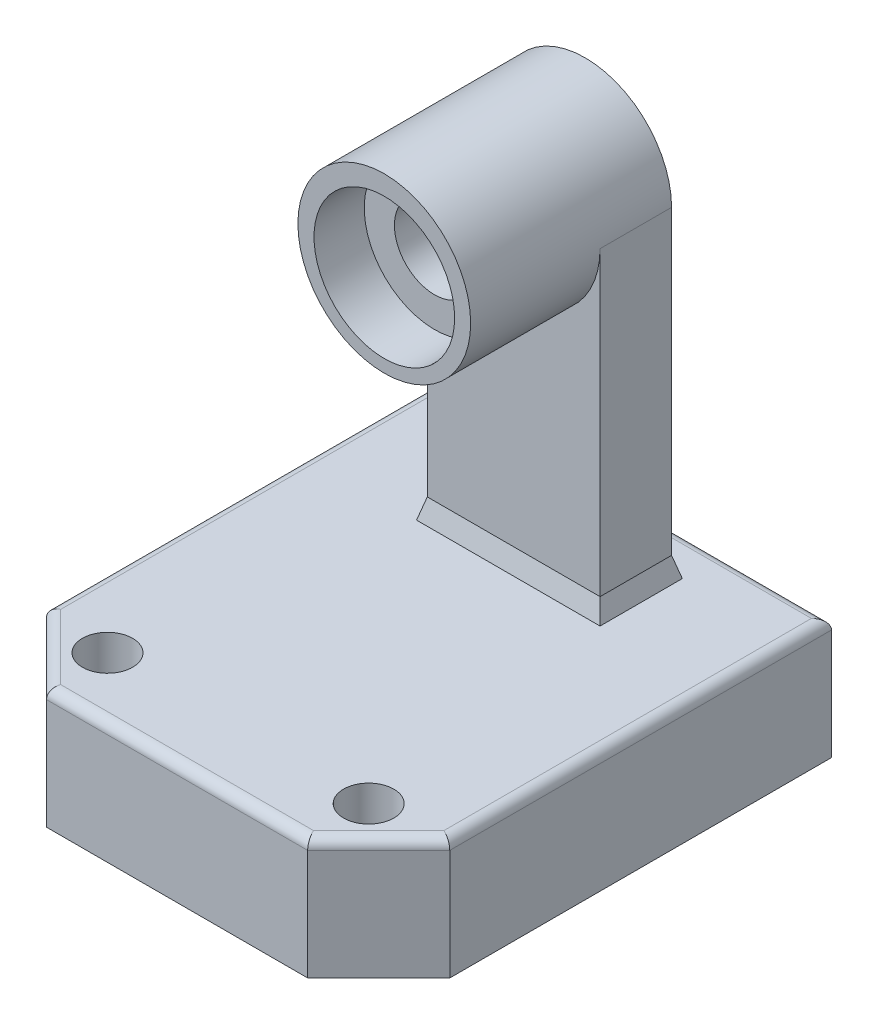
ISO-10303-21;
HEADER;
FILE_DESCRIPTION(('STEP AP214'),'2;1');
FILE_NAME('part.step','',(''),(''),'','','');
FILE_SCHEMA(('AUTOMOTIVE_DESIGN { 1 0 10303 214 1 1 1 1 }'));
ENDSEC;
DATA;
#1=APPLICATION_CONTEXT('core data for automotive mechanical design processes');
#2=APPLICATION_PROTOCOL_DEFINITION('international standard','automotive_design',2000,#1);
#3=PRODUCT_CONTEXT('',#1,'mechanical');
#4=PRODUCT('Part','Part','',(#3));
#5=PRODUCT_RELATED_PRODUCT_CATEGORY('part','',(#4));
#6=PRODUCT_DEFINITION_FORMATION('','',#4);
#7=PRODUCT_DEFINITION_CONTEXT('part definition',#1,'design');
#8=PRODUCT_DEFINITION('design','',#6,#7);
#9=PRODUCT_DEFINITION_SHAPE('','',#8);
#10=(LENGTH_UNIT() NAMED_UNIT(*) SI_UNIT(.MILLI.,.METRE.));
#11=(NAMED_UNIT(*) PLANE_ANGLE_UNIT() SI_UNIT($,.RADIAN.));
#12=(NAMED_UNIT(*) SI_UNIT($,.STERADIAN.) SOLID_ANGLE_UNIT());
#13=UNCERTAINTY_MEASURE_WITH_UNIT(LENGTH_MEASURE(1.E-05),#10,'distance_accuracy_value','');
#14=(GEOMETRIC_REPRESENTATION_CONTEXT(3) GLOBAL_UNCERTAINTY_ASSIGNED_CONTEXT((#13)) GLOBAL_UNIT_ASSIGNED_CONTEXT((#10,
#11,#12)) REPRESENTATION_CONTEXT('',''));
#15=CARTESIAN_POINT('',(0.,0.,0.));
#16=DIRECTION('',(0.,0.,1.));
#17=DIRECTION('',(1.,0.,0.));
#18=AXIS2_PLACEMENT_3D('',#15,#16,#17);
#19=CARTESIAN_POINT('',(0.,12.,0.));
#20=DIRECTION('',(0.,1.,0.));
#21=DIRECTION('',(0.,0.,1.));
#22=AXIS2_PLACEMENT_3D('',#19,#20,#21);
#23=PLANE('',#22);
#24=CARTESIAN_POINT('',(33.0710678118656,12.,39.));
#25=DIRECTION('',(0.,1.,0.));
#26=DIRECTION('',(0.,0.,1.));
#27=AXIS2_PLACEMENT_3D('',#24,#25,#26);
#28=CIRCLE('',#27,2.5);
#29=CARTESIAN_POINT('',(33.0710678118656,12.,41.5));
#30=VERTEX_POINT('',#29);
#31=EDGE_CURVE('E183',#30,#30,#28,.T.);
#32=ORIENTED_EDGE('',*,*,#31,.F.);
#33=EDGE_LOOP('',(#32));
#34=FACE_BOUND('',#33,.T.);
#35=CARTESIAN_POINT('',(7.07106781186556,12.,39.));
#36=DIRECTION('',(0.,1.,0.));
#37=DIRECTION('',(0.,0.,1.));
#38=AXIS2_PLACEMENT_3D('',#35,#36,#37);
#39=CIRCLE('',#38,2.5);
#40=CARTESIAN_POINT('',(7.07106781186556,12.,41.5));
#41=VERTEX_POINT('',#40);
#42=EDGE_CURVE('E180',#41,#41,#39,.T.);
#43=ORIENTED_EDGE('',*,*,#42,.F.);
#44=EDGE_LOOP('',(#43));
#45=FACE_BOUND('',#44,.T.);
#46=DIRECTION('',(0.,0.,1.));
#47=VECTOR('',#46,1.);
#48=CARTESIAN_POINT('',(39.1421356237311,12.,0.));
#49=LINE('',#48,#47);
#50=CARTESIAN_POINT('',(39.1421356237311,12.,37.5857864376269));
#51=VERTEX_POINT('',#50);
#52=CARTESIAN_POINT('',(39.1421356237311,12.,1.));
#53=VERTEX_POINT('',#52);
#54=EDGE_CURVE('E266',#51,#53,#49,.F.);
#55=ORIENTED_EDGE('',*,*,#54,.T.);
#56=DIRECTION('',(1.,0.,0.));
#57=VECTOR('',#56,1.);
#58=CARTESIAN_POINT('',(0.,12.,1.));
#59=LINE('',#58,#57);
#60=CARTESIAN_POINT('',(1.,12.,1.));
#61=VERTEX_POINT('',#60);
#62=EDGE_CURVE('E268',#53,#61,#59,.F.);
#63=ORIENTED_EDGE('',*,*,#62,.T.);
#64=DIRECTION('',(0.,0.,1.));
#65=VECTOR('',#64,1.);
#66=CARTESIAN_POINT('',(1.,12.,38.));
#67=LINE('',#66,#65);
#68=CARTESIAN_POINT('',(1.,12.,37.5857864376269));
#69=VERTEX_POINT('',#68);
#70=EDGE_CURVE('E258',#61,#69,#67,.T.);
#71=ORIENTED_EDGE('',*,*,#70,.T.);
#72=DIRECTION('',(0.707106781186557,0.,0.707106781186539));
#73=VECTOR('',#72,1.);
#74=CARTESIAN_POINT('',(7.77817459305211,12.,44.3639610306788));
#75=LINE('',#74,#73);
#76=CARTESIAN_POINT('',(7.48528137423865,12.,44.0710678118654));
#77=VERTEX_POINT('',#76);
#78=EDGE_CURVE('E260',#69,#77,#75,.T.);
#79=ORIENTED_EDGE('',*,*,#78,.T.);
#80=DIRECTION('',(1.,0.,0.));
#81=VECTOR('',#80,1.);
#82=CARTESIAN_POINT('',(33.0710678118656,12.,44.0710678118654));
#83=LINE('',#82,#81);
#84=CARTESIAN_POINT('',(32.6568542494925,12.,44.0710678118654));
#85=VERTEX_POINT('',#84);
#86=EDGE_CURVE('E262',#77,#85,#83,.T.);
#87=ORIENTED_EDGE('',*,*,#86,.T.);
#88=DIRECTION('',(0.707106781186556,0.,-0.707106781186539));
#89=VECTOR('',#88,1.);
#90=CARTESIAN_POINT('',(39.4350288425446,12.,37.2928932188134));
#91=LINE('',#90,#89);
#92=EDGE_CURVE('E264',#85,#51,#91,.T.);
#93=ORIENTED_EDGE('',*,*,#92,.T.);
#94=EDGE_LOOP('',(#55,#63,#71,#79,#87,#93));
#95=FACE_BOUND('',#94,.T.);
#96=DIRECTION('',(0.,0.,1.));
#97=VECTOR('',#96,1.);
#98=CARTESIAN_POINT('',(29.2843659279355,12.,3.99081846717642));
#99=LINE('',#98,#97);
#100=CARTESIAN_POINT('',(29.2843659279355,12.,3.99081846717642));
#101=VERTEX_POINT('',#100);
#102=CARTESIAN_POINT('',(29.2843659279355,12.,12.180416792572));
#103=VERTEX_POINT('',#102);
#104=EDGE_CURVE('E200',#101,#103,#99,.T.);
#105=ORIENTED_EDGE('',*,*,#104,.T.);
#106=DIRECTION('',(1.,0.,0.));
#107=VECTOR('',#106,1.);
#108=CARTESIAN_POINT('',(11.015261971284,12.,12.180416792572));
#109=LINE('',#108,#107);
#110=CARTESIAN_POINT('',(11.015261971284,12.,12.180416792572));
#111=VERTEX_POINT('',#110);
#112=EDGE_CURVE('E197',#111,#103,#109,.T.);
#113=ORIENTED_EDGE('',*,*,#112,.F.);
#114=DIRECTION('',(0.,0.,1.));
#115=VECTOR('',#114,1.);
#116=CARTESIAN_POINT('',(11.015261971284,12.,3.99081846717642));
#117=LINE('',#116,#115);
#118=CARTESIAN_POINT('',(11.015261971284,12.,3.99081846717642));
#119=VERTEX_POINT('',#118);
#120=EDGE_CURVE('E204',#119,#111,#117,.T.);
#121=ORIENTED_EDGE('',*,*,#120,.F.);
#122=DIRECTION('',(1.,0.,0.));
#123=VECTOR('',#122,1.);
#124=CARTESIAN_POINT('',(11.015261971284,12.,3.99081846717642));
#125=LINE('',#124,#123);
#126=EDGE_CURVE('E50',#119,#101,#125,.T.);
#127=ORIENTED_EDGE('',*,*,#126,.T.);
#128=EDGE_LOOP('',(#105,#113,#121,#127));
#129=FACE_BOUND('',#128,.T.);
#130=ADVANCED_FACE('F33',(#34,#45,#95,#129),#23,.T.);
#131=CARTESIAN_POINT('',(0.,12.,0.));
#132=DIRECTION('',(1.,0.,0.));
#133=DIRECTION('',(0.,0.,-1.));
#134=AXIS2_PLACEMENT_3D('',#131,#132,#133);
#135=PLANE('',#134);
#136=DIRECTION('',(0.,-1.,0.));
#137=VECTOR('',#136,1.);
#138=CARTESIAN_POINT('',(0.,12.,38.));
#139=LINE('',#138,#137);
#140=CARTESIAN_POINT('',(0.,11.,38.));
#141=VERTEX_POINT('',#140);
#142=CARTESIAN_POINT('',(0.,0.,38.));
#143=VERTEX_POINT('',#142);
#144=EDGE_CURVE('E253',#141,#143,#139,.T.);
#145=ORIENTED_EDGE('',*,*,#144,.F.);
#146=DIRECTION('',(0.,0.,1.));
#147=VECTOR('',#146,1.);
#148=CARTESIAN_POINT('',(0.,11.,0.));
#149=LINE('',#148,#147);
#150=CARTESIAN_POINT('',(0.,11.,0.));
#151=VERTEX_POINT('',#150);
#152=EDGE_CURVE('E11',#141,#151,#149,.F.);
#153=ORIENTED_EDGE('',*,*,#152,.T.);
#154=DIRECTION('',(0.,-1.,0.));
#155=VECTOR('',#154,1.);
#156=CARTESIAN_POINT('',(0.,12.,0.));
#157=LINE('',#156,#155);
#158=CARTESIAN_POINT('',(0.,0.,0.));
#159=VERTEX_POINT('',#158);
#160=EDGE_CURVE('E243',#151,#159,#157,.T.);
#161=ORIENTED_EDGE('',*,*,#160,.T.);
#162=DIRECTION('',(0.,0.,1.));
#163=VECTOR('',#162,1.);
#164=CARTESIAN_POINT('',(0.,0.,0.));
#165=LINE('',#164,#163);
#166=EDGE_CURVE('E225',#159,#143,#165,.T.);
#167=ORIENTED_EDGE('',*,*,#166,.T.);
#168=EDGE_LOOP('',(#145,#153,#161,#167));
#169=FACE_BOUND('',#168,.T.);
#170=ADVANCED_FACE('F313',(#169),#135,.F.);
#171=CARTESIAN_POINT('',(0.,12.,38.));
#172=DIRECTION('',(0.707106781186539,0.,-0.707106781186557));
#173=DIRECTION('',(-0.707106781186557,0.,-0.707106781186539));
#174=AXIS2_PLACEMENT_3D('',#171,#172,#173);
#175=PLANE('',#174);
#176=DIRECTION('',(0.,-1.,0.));
#177=VECTOR('',#176,1.);
#178=CARTESIAN_POINT('',(7.07106781186557,12.,45.0710678118654));
#179=LINE('',#178,#177);
#180=CARTESIAN_POINT('',(7.07106781186557,11.,45.0710678118654));
#181=VERTEX_POINT('',#180);
#182=CARTESIAN_POINT('',(7.07106781186557,0.,45.0710678118654));
#183=VERTEX_POINT('',#182);
#184=EDGE_CURVE('E251',#181,#183,#179,.T.);
#185=ORIENTED_EDGE('',*,*,#184,.F.);
#186=DIRECTION('',(0.707106781186557,0.,0.707106781186539));
#187=VECTOR('',#186,1.);
#188=CARTESIAN_POINT('',(0.,11.,38.));
#189=LINE('',#188,#187);
#190=EDGE_CURVE('E42',#181,#141,#189,.F.);
#191=ORIENTED_EDGE('',*,*,#190,.T.);
#192=ORIENTED_EDGE('',*,*,#144,.T.);
#193=DIRECTION('',(0.707106781186556,0.,0.707106781186538));
#194=VECTOR('',#193,1.);
#195=CARTESIAN_POINT('',(0.,0.,38.));
#196=LINE('',#195,#194);
#197=EDGE_CURVE('E228',#143,#183,#196,.T.);
#198=ORIENTED_EDGE('',*,*,#197,.T.);
#199=EDGE_LOOP('',(#185,#191,#192,#198));
#200=FACE_BOUND('',#199,.T.);
#201=ADVANCED_FACE('F325',(#200),#175,.F.);
#202=CARTESIAN_POINT('',(7.07106781186557,12.,45.0710678118654));
#203=DIRECTION('',(0.,0.,-1.));
#204=DIRECTION('',(-1.,0.,0.));
#205=AXIS2_PLACEMENT_3D('',#202,#203,#204);
#206=PLANE('',#205);
#207=DIRECTION('',(0.,-1.,0.));
#208=VECTOR('',#207,1.);
#209=CARTESIAN_POINT('',(33.0710678118656,12.,45.0710678118654));
#210=LINE('',#209,#208);
#211=CARTESIAN_POINT('',(33.0710678118656,11.,45.0710678118654));
#212=VERTEX_POINT('',#211);
#213=CARTESIAN_POINT('',(33.0710678118656,0.,45.0710678118654));
#214=VERTEX_POINT('',#213);
#215=EDGE_CURVE('E249',#212,#214,#210,.T.);
#216=ORIENTED_EDGE('',*,*,#215,.F.);
#217=DIRECTION('',(1.,0.,0.));
#218=VECTOR('',#217,1.);
#219=CARTESIAN_POINT('',(7.07106781186557,11.,45.0710678118654));
#220=LINE('',#219,#218);
#221=EDGE_CURVE('E275',#212,#181,#220,.F.);
#222=ORIENTED_EDGE('',*,*,#221,.T.);
#223=ORIENTED_EDGE('',*,*,#184,.T.);
#224=DIRECTION('',(1.,0.,0.));
#225=VECTOR('',#224,1.);
#226=CARTESIAN_POINT('',(7.07106781186557,0.,45.0710678118654));
#227=LINE('',#226,#225);
#228=EDGE_CURVE('E231',#183,#214,#227,.T.);
#229=ORIENTED_EDGE('',*,*,#228,.T.);
#230=EDGE_LOOP('',(#216,#222,#223,#229));
#231=FACE_BOUND('',#230,.T.);
#232=ADVANCED_FACE('F328',(#231),#206,.F.);
#233=CARTESIAN_POINT('',(33.0710678118656,12.,45.0710678118654));
#234=DIRECTION('',(-0.707106781186539,0.,-0.707106781186556));
#235=DIRECTION('',(-0.707106781186556,0.,0.707106781186539));
#236=AXIS2_PLACEMENT_3D('',#233,#234,#235);
#237=PLANE('',#236);
#238=DIRECTION('',(0.,-1.,0.));
#239=VECTOR('',#238,1.);
#240=CARTESIAN_POINT('',(40.1421356237311,12.,38.));
#241=LINE('',#240,#239);
#242=CARTESIAN_POINT('',(40.1421356237311,11.,38.));
#243=VERTEX_POINT('',#242);
#244=CARTESIAN_POINT('',(40.1421356237311,0.,38.));
#245=VERTEX_POINT('',#244);
#246=EDGE_CURVE('E247',#243,#245,#241,.T.);
#247=ORIENTED_EDGE('',*,*,#246,.F.);
#248=DIRECTION('',(0.707106781186556,0.,-0.707106781186539));
#249=VECTOR('',#248,1.);
#250=CARTESIAN_POINT('',(33.0710678118656,11.,45.0710678118654));
#251=LINE('',#250,#249);
#252=EDGE_CURVE('E273',#243,#212,#251,.F.);
#253=ORIENTED_EDGE('',*,*,#252,.T.);
#254=ORIENTED_EDGE('',*,*,#215,.T.);
#255=DIRECTION('',(0.707106781186556,0.,-0.707106781186539));
#256=VECTOR('',#255,1.);
#257=CARTESIAN_POINT('',(33.0710678118656,0.,45.0710678118654));
#258=LINE('',#257,#256);
#259=EDGE_CURVE('E234',#214,#245,#258,.T.);
#260=ORIENTED_EDGE('',*,*,#259,.T.);
#261=EDGE_LOOP('',(#247,#253,#254,#260));
#262=FACE_BOUND('',#261,.T.);
#263=ADVANCED_FACE('F331',(#262),#237,.F.);
#264=CARTESIAN_POINT('',(40.1421356237311,12.,0.));
#265=DIRECTION('',(1.,0.,0.));
#266=DIRECTION('',(0.,0.,-1.));
#267=AXIS2_PLACEMENT_3D('',#264,#265,#266);
#268=PLANE('',#267);
#269=DIRECTION('',(0.,-1.,0.));
#270=VECTOR('',#269,1.);
#271=CARTESIAN_POINT('',(40.1421356237311,12.,0.));
#272=LINE('',#271,#270);
#273=CARTESIAN_POINT('',(40.1421356237311,11.,0.));
#274=VERTEX_POINT('',#273);
#275=CARTESIAN_POINT('',(40.1421356237311,0.,0.));
#276=VERTEX_POINT('',#275);
#277=EDGE_CURVE('E245',#274,#276,#272,.T.);
#278=ORIENTED_EDGE('',*,*,#277,.F.);
#279=DIRECTION('',(0.,0.,1.));
#280=VECTOR('',#279,1.);
#281=CARTESIAN_POINT('',(40.1421356237311,11.,0.));
#282=LINE('',#281,#280);
#283=EDGE_CURVE('E271',#274,#243,#282,.T.);
#284=ORIENTED_EDGE('',*,*,#283,.T.);
#285=ORIENTED_EDGE('',*,*,#246,.T.);
#286=DIRECTION('',(0.,0.,1.));
#287=VECTOR('',#286,1.);
#288=CARTESIAN_POINT('',(40.1421356237311,0.,0.));
#289=LINE('',#288,#287);
#290=EDGE_CURVE('E237',#276,#245,#289,.T.);
#291=ORIENTED_EDGE('',*,*,#290,.F.);
#292=EDGE_LOOP('',(#278,#284,#285,#291));
#293=FACE_BOUND('',#292,.T.);
#294=ADVANCED_FACE('F367',(#293),#268,.T.);
#295=CARTESIAN_POINT('',(0.,12.,0.));
#296=DIRECTION('',(0.,0.,-1.));
#297=DIRECTION('',(-1.,0.,0.));
#298=AXIS2_PLACEMENT_3D('',#295,#296,#297);
#299=PLANE('',#298);
#300=ORIENTED_EDGE('',*,*,#160,.F.);
#301=DIRECTION('',(1.,0.,0.));
#302=VECTOR('',#301,1.);
#303=CARTESIAN_POINT('',(0.,11.,0.));
#304=LINE('',#303,#302);
#305=EDGE_CURVE('E255',#151,#274,#304,.T.);
#306=ORIENTED_EDGE('',*,*,#305,.T.);
#307=ORIENTED_EDGE('',*,*,#277,.T.);
#308=DIRECTION('',(1.,0.,0.));
#309=VECTOR('',#308,1.);
#310=CARTESIAN_POINT('',(0.,0.,0.));
#311=LINE('',#310,#309);
#312=EDGE_CURVE('E240',#159,#276,#311,.T.);
#313=ORIENTED_EDGE('',*,*,#312,.F.);
#314=EDGE_LOOP('',(#300,#306,#307,#313));
#315=FACE_BOUND('',#314,.T.);
#316=ADVANCED_FACE('F317',(#315),#299,.T.);
#317=CARTESIAN_POINT('',(0.,0.,0.));
#318=DIRECTION('',(0.,1.,0.));
#319=DIRECTION('',(0.,0.,1.));
#320=AXIS2_PLACEMENT_3D('',#317,#318,#319);
#321=PLANE('',#320);
#322=ORIENTED_EDGE('',*,*,#166,.F.);
#323=ORIENTED_EDGE('',*,*,#312,.T.);
#324=ORIENTED_EDGE('',*,*,#290,.T.);
#325=ORIENTED_EDGE('',*,*,#259,.F.);
#326=ORIENTED_EDGE('',*,*,#228,.F.);
#327=ORIENTED_EDGE('',*,*,#197,.F.);
#328=EDGE_LOOP('',(#322,#323,#324,#325,#326,#327));
#329=FACE_BOUND('',#328,.T.);
#330=ADVANCED_FACE('F321',(#329),#321,.F.);
#331=CARTESIAN_POINT('',(0.,11.,44.0710678118654));
#332=DIRECTION('',(-1.,0.,0.));
#333=DIRECTION('',(0.,0.,1.));
#334=AXIS2_PLACEMENT_3D('',#331,#332,#333);
#335=CYLINDRICAL_SURFACE('',#334,1.);
#336=CARTESIAN_POINT('',(32.6568542494925,11.,44.0710678118654));
#337=DIRECTION('',(-0.923879532511289,0.,0.382683432365084));
#338=DIRECTION('',(-0.382683432365084,0.,-0.923879532511289));
#339=AXIS2_PLACEMENT_3D('',#336,#337,#338);
#340=ELLIPSE('',#339,1.08239220029239,1.);
#341=EDGE_CURVE('E286',#85,#212,#340,.F.);
#342=ORIENTED_EDGE('',*,*,#341,.F.);
#343=ORIENTED_EDGE('',*,*,#86,.F.);
#344=CARTESIAN_POINT('',(7.48528137423865,11.,44.0710678118654));
#345=DIRECTION('',(-0.923879532511289,0.,-0.382683432365084));
#346=DIRECTION('',(0.382683432365084,0.,-0.923879532511289));
#347=AXIS2_PLACEMENT_3D('',#344,#345,#346);
#348=ELLIPSE('',#347,1.08239220029239,1.);
#349=EDGE_CURVE('E37',#181,#77,#348,.T.);
#350=ORIENTED_EDGE('',*,*,#349,.F.);
#351=ORIENTED_EDGE('',*,*,#221,.F.);
#352=EDGE_LOOP('',(#342,#343,#350,#351));
#353=FACE_BOUND('',#352,.T.);
#354=ADVANCED_FACE('F35',(#353),#335,.T.);
#355=CARTESIAN_POINT('',(-18.2928932188135,11.,18.2928932188139));
#356=DIRECTION('',(-0.707106781186557,0.,-0.707106781186539));
#357=DIRECTION('',(-0.707106781186539,0.,0.707106781186557));
#358=AXIS2_PLACEMENT_3D('',#355,#356,#357);
#359=CYLINDRICAL_SURFACE('',#358,1.);
#360=ORIENTED_EDGE('',*,*,#349,.T.);
#361=ORIENTED_EDGE('',*,*,#78,.F.);
#362=CARTESIAN_POINT('',(1.,11.,37.5857864376269));
#363=DIRECTION('',(-0.382683432365096,0.,-0.923879532511284));
#364=DIRECTION('',(0.923879532511284,0.,-0.382683432365096));
#365=AXIS2_PLACEMENT_3D('',#362,#363,#364);
#366=ELLIPSE('',#365,1.0823922002924,1.);
#367=EDGE_CURVE('E284',#141,#69,#366,.T.);
#368=ORIENTED_EDGE('',*,*,#367,.F.);
#369=ORIENTED_EDGE('',*,*,#190,.F.);
#370=EDGE_LOOP('',(#360,#361,#368,#369));
#371=FACE_BOUND('',#370,.T.);
#372=ADVANCED_FACE('F296',(#371),#359,.T.);
#373=CARTESIAN_POINT('',(38.3639610306785,11.,38.3639610306795));
#374=DIRECTION('',(-0.707106781186556,0.,0.707106781186539));
#375=DIRECTION('',(0.707106781186539,0.,0.707106781186556));
#376=AXIS2_PLACEMENT_3D('',#373,#374,#375);
#377=CYLINDRICAL_SURFACE('',#376,1.);
#378=ORIENTED_EDGE('',*,*,#341,.T.);
#379=ORIENTED_EDGE('',*,*,#252,.F.);
#380=CARTESIAN_POINT('',(39.1421356237311,11.,37.5857864376269));
#381=DIRECTION('',(-0.382683432365095,0.,0.923879532511285));
#382=DIRECTION('',(-0.923879532511285,0.,-0.382683432365095));
#383=AXIS2_PLACEMENT_3D('',#380,#381,#382);
#384=ELLIPSE('',#383,1.0823922002924,1.);
#385=EDGE_CURVE('E281',#51,#243,#384,.F.);
#386=ORIENTED_EDGE('',*,*,#385,.F.);
#387=ORIENTED_EDGE('',*,*,#92,.F.);
#388=EDGE_LOOP('',(#378,#379,#386,#387));
#389=FACE_BOUND('',#388,.T.);
#390=ADVANCED_FACE('F332',(#389),#377,.T.);
#391=CARTESIAN_POINT('',(1.,11.,0.));
#392=DIRECTION('',(0.,0.,-1.));
#393=DIRECTION('',(-1.,0.,0.));
#394=AXIS2_PLACEMENT_3D('',#391,#392,#393);
#395=CYLINDRICAL_SURFACE('',#394,1.);
#396=ORIENTED_EDGE('',*,*,#367,.T.);
#397=ORIENTED_EDGE('',*,*,#70,.F.);
#398=CARTESIAN_POINT('',(1.,11.,1.));
#399=DIRECTION('',(0.707106781186547,0.,-0.707106781186547));
#400=DIRECTION('',(-0.707106781186547,0.,-0.707106781186547));
#401=AXIS2_PLACEMENT_3D('',#398,#399,#400);
#402=ELLIPSE('',#401,1.41421356237309,1.);
#403=EDGE_CURVE('E279',#151,#61,#402,.T.);
#404=ORIENTED_EDGE('',*,*,#403,.F.);
#405=ORIENTED_EDGE('',*,*,#152,.F.);
#406=EDGE_LOOP('',(#396,#397,#404,#405));
#407=FACE_BOUND('',#406,.T.);
#408=ADVANCED_FACE('F308',(#407),#395,.T.);
#409=CARTESIAN_POINT('',(39.1421356237311,11.,0.));
#410=DIRECTION('',(0.,0.,1.));
#411=DIRECTION('',(1.,0.,0.));
#412=AXIS2_PLACEMENT_3D('',#409,#410,#411);
#413=CYLINDRICAL_SURFACE('',#412,1.);
#414=ORIENTED_EDGE('',*,*,#385,.T.);
#415=ORIENTED_EDGE('',*,*,#283,.F.);
#416=CARTESIAN_POINT('',(39.1421356237311,11.,1.));
#417=DIRECTION('',(0.707106781186548,0.,0.707106781186547));
#418=DIRECTION('',(-0.707106781186547,0.,0.707106781186548));
#419=AXIS2_PLACEMENT_3D('',#416,#417,#418);
#420=ELLIPSE('',#419,1.41421356237309,1.);
#421=EDGE_CURVE('E209',#53,#274,#420,.F.);
#422=ORIENTED_EDGE('',*,*,#421,.F.);
#423=ORIENTED_EDGE('',*,*,#54,.F.);
#424=EDGE_LOOP('',(#414,#415,#422,#423));
#425=FACE_BOUND('',#424,.T.);
#426=ADVANCED_FACE('F336',(#425),#413,.T.);
#427=CARTESIAN_POINT('',(0.,11.,1.));
#428=DIRECTION('',(1.,0.,0.));
#429=DIRECTION('',(0.,0.,-1.));
#430=AXIS2_PLACEMENT_3D('',#427,#428,#429);
#431=CYLINDRICAL_SURFACE('',#430,1.);
#432=ORIENTED_EDGE('',*,*,#403,.T.);
#433=ORIENTED_EDGE('',*,*,#62,.F.);
#434=ORIENTED_EDGE('',*,*,#421,.T.);
#435=ORIENTED_EDGE('',*,*,#305,.F.);
#436=EDGE_LOOP('',(#432,#433,#434,#435));
#437=FACE_BOUND('',#436,.T.);
#438=ADVANCED_FACE('F339',(#437),#431,.T.);
#439=CARTESIAN_POINT('',(11.015261971284,12.,12.180416792572));
#440=DIRECTION('',(0.,0.258819045102521,0.965925826289068));
#441=DIRECTION('',(0.,-0.965925826289068,0.258819045102521));
#442=AXIS2_PLACEMENT_3D('',#439,#440,#441);
#443=PLANE('',#442);
#444=ORIENTED_EDGE('',*,*,#112,.T.);
#445=DIRECTION('',(-0.250562807085732,0.935113126531029,-0.250562807085732));
#446=VECTOR('',#445,1.);
#447=CARTESIAN_POINT('',(28.1374001532946,16.2805345455027,11.033451017931));
#448=LINE('',#447,#446);
#449=CARTESIAN_POINT('',(28.7484675430733,14.,11.6445184077097));
#450=VERTEX_POINT('',#449);
#451=EDGE_CURVE('E207',#450,#103,#448,.F.);
#452=ORIENTED_EDGE('',*,*,#451,.F.);
#453=DIRECTION('',(-1.,0.,0.));
#454=VECTOR('',#453,1.);
#455=CARTESIAN_POINT('',(0.,14.,11.6445184077097));
#456=LINE('',#455,#454);
#457=CARTESIAN_POINT('',(11.5511603561462,14.,11.6445184077097));
#458=VERTEX_POINT('',#457);
#459=EDGE_CURVE('E206',#458,#450,#456,.F.);
#460=ORIENTED_EDGE('',*,*,#459,.F.);
#461=DIRECTION('',(-0.250562807085732,-0.935113126531029,0.250562807085732));
#462=VECTOR('',#461,1.);
#463=CARTESIAN_POINT('',(11.015261971284,12.,12.180416792572));
#464=LINE('',#463,#462);
#465=EDGE_CURVE('E211',#458,#111,#464,.T.);
#466=ORIENTED_EDGE('',*,*,#465,.T.);
#467=EDGE_LOOP('',(#444,#452,#460,#466));
#468=FACE_BOUND('',#467,.T.);
#469=ADVANCED_FACE('F341',(#468),#443,.T.);
#470=CARTESIAN_POINT('',(29.2843659279355,12.,3.99081846717642));
#471=DIRECTION('',(0.965925826289068,0.258819045102521,0.));
#472=DIRECTION('',(-0.258819045102521,0.965925826289068,0.));
#473=AXIS2_PLACEMENT_3D('',#470,#471,#472);
#474=PLANE('',#473);
#475=ORIENTED_EDGE('',*,*,#104,.F.);
#476=DIRECTION('',(0.250562807085732,-0.935113126531029,-0.250562807085732));
#477=VECTOR('',#476,1.);
#478=CARTESIAN_POINT('',(28.1374001532946,16.2805345455027,5.13778424181739));
#479=LINE('',#478,#477);
#480=CARTESIAN_POINT('',(28.7484675430733,14.,4.52671685203867));
#481=VERTEX_POINT('',#480);
#482=EDGE_CURVE('E210',#481,#101,#479,.T.);
#483=ORIENTED_EDGE('',*,*,#482,.F.);
#484=DIRECTION('',(0.,0.,1.));
#485=VECTOR('',#484,1.);
#486=CARTESIAN_POINT('',(28.7484675430733,14.,0.));
#487=LINE('',#486,#485);
#488=EDGE_CURVE('E220',#481,#450,#487,.T.);
#489=ORIENTED_EDGE('',*,*,#488,.T.);
#490=ORIENTED_EDGE('',*,*,#451,.T.);
#491=EDGE_LOOP('',(#475,#483,#489,#490));
#492=FACE_BOUND('',#491,.T.);
#493=ADVANCED_FACE('F347',(#492),#474,.T.);
#494=CARTESIAN_POINT('',(11.015261971284,12.,3.99081846717642));
#495=DIRECTION('',(0.,0.258819045102521,-0.965925826289068));
#496=DIRECTION('',(0.,0.965925826289068,0.258819045102521));
#497=AXIS2_PLACEMENT_3D('',#494,#495,#496);
#498=PLANE('',#497);
#499=ORIENTED_EDGE('',*,*,#126,.F.);
#500=DIRECTION('',(0.250562807085732,0.935113126531029,0.250562807085732));
#501=VECTOR('',#500,1.);
#502=CARTESIAN_POINT('',(11.015261971284,12.,3.99081846717642));
#503=LINE('',#502,#501);
#504=CARTESIAN_POINT('',(11.5511603561462,14.,4.52671685203867));
#505=VERTEX_POINT('',#504);
#506=EDGE_CURVE('E214',#505,#119,#503,.F.);
#507=ORIENTED_EDGE('',*,*,#506,.F.);
#508=DIRECTION('',(1.,0.,0.));
#509=VECTOR('',#508,1.);
#510=CARTESIAN_POINT('',(0.,14.,4.52671685203867));
#511=LINE('',#510,#509);
#512=EDGE_CURVE('E162',#505,#481,#511,.T.);
#513=ORIENTED_EDGE('',*,*,#512,.T.);
#514=ORIENTED_EDGE('',*,*,#482,.T.);
#515=EDGE_LOOP('',(#499,#507,#513,#514));
#516=FACE_BOUND('',#515,.T.);
#517=ADVANCED_FACE('F446',(#516),#498,.T.);
#518=CARTESIAN_POINT('',(11.015261971284,12.,3.99081846717642));
#519=DIRECTION('',(-0.965925826289068,0.258819045102521,0.));
#520=DIRECTION('',(-0.258819045102521,-0.965925826289068,0.));
#521=AXIS2_PLACEMENT_3D('',#518,#519,#520);
#522=PLANE('',#521);
#523=ORIENTED_EDGE('',*,*,#120,.T.);
#524=ORIENTED_EDGE('',*,*,#465,.F.);
#525=DIRECTION('',(0.,0.,-1.));
#526=VECTOR('',#525,1.);
#527=CARTESIAN_POINT('',(11.5511603561462,14.,0.));
#528=LINE('',#527,#526);
#529=EDGE_CURVE('E215',#505,#458,#528,.F.);
#530=ORIENTED_EDGE('',*,*,#529,.F.);
#531=ORIENTED_EDGE('',*,*,#506,.T.);
#532=EDGE_LOOP('',(#523,#524,#530,#531));
#533=FACE_BOUND('',#532,.T.);
#534=ADVANCED_FACE('F455',(#533),#522,.T.);
#535=CARTESIAN_POINT('',(11.5511603561462,44.,4.52671685203867));
#536=DIRECTION('',(1.,0.,0.));
#537=DIRECTION('',(0.,0.,-1.));
#538=AXIS2_PLACEMENT_3D('',#535,#536,#537);
#539=PLANE('',#538);
#540=ORIENTED_EDGE('',*,*,#529,.T.);
#541=DIRECTION('',(0.,-1.,0.));
#542=VECTOR('',#541,1.);
#543=CARTESIAN_POINT('',(11.5511603561462,44.,11.6445184077097));
#544=LINE('',#543,#542);
#545=CARTESIAN_POINT('',(11.5511603561462,44.,11.6445184077097));
#546=VERTEX_POINT('',#545);
#547=EDGE_CURVE('E148',#546,#458,#544,.T.);
#548=ORIENTED_EDGE('',*,*,#547,.F.);
#549=DIRECTION('',(0.,0.,1.));
#550=VECTOR('',#549,1.);
#551=CARTESIAN_POINT('',(11.5511603561462,44.,4.52671685203867));
#552=LINE('',#551,#550);
#553=CARTESIAN_POINT('',(11.5511603561462,44.,4.52671685203867));
#554=VERTEX_POINT('',#553);
#555=EDGE_CURVE('E142',#554,#546,#552,.T.);
#556=ORIENTED_EDGE('',*,*,#555,.F.);
#557=DIRECTION('',(0.,-1.,0.));
#558=VECTOR('',#557,1.);
#559=CARTESIAN_POINT('',(11.5511603561462,44.,4.52671685203867));
#560=LINE('',#559,#558);
#561=EDGE_CURVE('E146',#554,#505,#560,.T.);
#562=ORIENTED_EDGE('',*,*,#561,.T.);
#563=EDGE_LOOP('',(#540,#548,#556,#562));
#564=FACE_BOUND('',#563,.T.);
#565=ADVANCED_FACE('F145',(#564),#539,.F.);
#566=CARTESIAN_POINT('',(11.5511603561462,44.,11.6445184077097));
#567=DIRECTION('',(0.,0.,-1.));
#568=DIRECTION('',(-1.,0.,0.));
#569=AXIS2_PLACEMENT_3D('',#566,#567,#568);
#570=PLANE('',#569);
#571=DIRECTION('',(0.,-1.,0.));
#572=VECTOR('',#571,1.);
#573=CARTESIAN_POINT('',(28.7484675430733,44.,11.6445184077097));
#574=LINE('',#573,#572);
#575=CARTESIAN_POINT('',(28.7484675430733,44.,11.6445184077097));
#576=VERTEX_POINT('',#575);
#577=EDGE_CURVE('E193',#576,#450,#574,.T.);
#578=ORIENTED_EDGE('',*,*,#577,.F.);
#579=CARTESIAN_POINT('',(20.1498139496098,44.,11.6445184077097));
#580=DIRECTION('',(0.,0.,-1.));
#581=DIRECTION('',(-1.,0.,0.));
#582=AXIS2_PLACEMENT_3D('',#579,#580,#581);
#583=CIRCLE('',#582,8.59865359346354);
#584=EDGE_CURVE('E172',#576,#546,#583,.T.);
#585=ORIENTED_EDGE('',*,*,#584,.T.);
#586=ORIENTED_EDGE('',*,*,#547,.T.);
#587=ORIENTED_EDGE('',*,*,#459,.T.);
#588=EDGE_LOOP('',(#578,#585,#586,#587));
#589=FACE_BOUND('',#588,.T.);
#590=ADVANCED_FACE('F519',(#589),#570,.F.);
#591=CARTESIAN_POINT('',(28.7484675430733,44.,4.52671685203867));
#592=DIRECTION('',(-1.,0.,0.));
#593=DIRECTION('',(0.,0.,1.));
#594=AXIS2_PLACEMENT_3D('',#591,#592,#593);
#595=PLANE('',#594);
#596=ORIENTED_EDGE('',*,*,#488,.F.);
#597=DIRECTION('',(0.,-1.,0.));
#598=VECTOR('',#597,1.);
#599=CARTESIAN_POINT('',(28.7484675430733,44.,4.52671685203867));
#600=LINE('',#599,#598);
#601=CARTESIAN_POINT('',(28.7484675430733,44.,4.52671685203867));
#602=VERTEX_POINT('',#601);
#603=EDGE_CURVE('E163',#602,#481,#600,.T.);
#604=ORIENTED_EDGE('',*,*,#603,.F.);
#605=DIRECTION('',(0.,0.,-1.));
#606=VECTOR('',#605,1.);
#607=CARTESIAN_POINT('',(28.7484675430733,44.,4.52671685203867));
#608=LINE('',#607,#606);
#609=EDGE_CURVE('E152',#576,#602,#608,.T.);
#610=ORIENTED_EDGE('',*,*,#609,.F.);
#611=ORIENTED_EDGE('',*,*,#577,.T.);
#612=EDGE_LOOP('',(#596,#604,#610,#611));
#613=FACE_BOUND('',#612,.T.);
#614=ADVANCED_FACE('F528',(#613),#595,.F.);
#615=CARTESIAN_POINT('',(11.5511603561462,44.,4.52671685203867));
#616=DIRECTION('',(0.,0.,1.));
#617=DIRECTION('',(1.,0.,0.));
#618=AXIS2_PLACEMENT_3D('',#615,#616,#617);
#619=PLANE('',#618);
#620=CARTESIAN_POINT('',(20.1552289606585,43.6668177167932,4.52671685203867));
#621=DIRECTION('',(0.,0.,1.));
#622=DIRECTION('',(1.,0.,0.));
#623=AXIS2_PLACEMENT_3D('',#620,#621,#622);
#624=CIRCLE('',#623,3.99890548034327);
#625=CARTESIAN_POINT('',(24.1541344410018,43.6668177167932,4.52671685203867));
#626=VERTEX_POINT('',#625);
#627=EDGE_CURVE('E603',#626,#626,#624,.T.);
#628=ORIENTED_EDGE('',*,*,#627,.T.);
#629=EDGE_LOOP('',(#628));
#630=FACE_BOUND('',#629,.T.);
#631=ORIENTED_EDGE('',*,*,#561,.F.);
#632=CARTESIAN_POINT('',(20.1498139496098,44.,4.52671685203867));
#633=DIRECTION('',(0.,0.,-1.));
#634=DIRECTION('',(-1.,0.,0.));
#635=AXIS2_PLACEMENT_3D('',#632,#633,#634);
#636=CIRCLE('',#635,8.59865359346354);
#637=EDGE_CURVE('E160',#554,#602,#636,.T.);
#638=ORIENTED_EDGE('',*,*,#637,.T.);
#639=ORIENTED_EDGE('',*,*,#603,.T.);
#640=ORIENTED_EDGE('',*,*,#512,.F.);
#641=EDGE_LOOP('',(#631,#638,#639,#640));
#642=FACE_BOUND('',#641,.T.);
#643=ADVANCED_FACE('F158',(#630,#642),#619,.F.);
#644=CARTESIAN_POINT('',(7.07106781186556,4.00000000000002,39.));
#645=DIRECTION('',(0.,1.,0.));
#646=DIRECTION('',(0.,0.,1.));
#647=AXIS2_PLACEMENT_3D('',#644,#645,#646);
#648=CYLINDRICAL_SURFACE('',#647,2.5);
#649=CARTESIAN_POINT('',(7.07106781186556,4.00000000000002,39.));
#650=DIRECTION('',(0.,1.,0.));
#651=DIRECTION('',(0.,0.,1.));
#652=AXIS2_PLACEMENT_3D('',#649,#650,#651);
#653=CIRCLE('',#652,2.5);
#654=CARTESIAN_POINT('',(7.07106781186556,4.00000000000002,41.5));
#655=VERTEX_POINT('',#654);
#656=EDGE_CURVE('E186',#655,#655,#653,.T.);
#657=ORIENTED_EDGE('',*,*,#656,.F.);
#658=EDGE_LOOP('',(#657));
#659=FACE_BOUND('',#658,.T.);
#660=ORIENTED_EDGE('',*,*,#42,.T.);
#661=EDGE_LOOP('',(#660));
#662=FACE_BOUND('',#661,.T.);
#663=ADVANCED_FACE('F473',(#659,#662),#648,.F.);
#664=CARTESIAN_POINT('',(7.07106781186556,4.00000000000002,39.));
#665=DIRECTION('',(0.,1.,0.));
#666=DIRECTION('',(0.,0.,1.));
#667=AXIS2_PLACEMENT_3D('',#664,#665,#666);
#668=PLANE('',#667);
#669=ORIENTED_EDGE('',*,*,#656,.T.);
#670=EDGE_LOOP('',(#669));
#671=FACE_BOUND('',#670,.T.);
#672=ADVANCED_FACE('F478',(#671),#668,.T.);
#673=CARTESIAN_POINT('',(33.0710678118656,4.00000000000002,39.));
#674=DIRECTION('',(0.,1.,0.));
#675=DIRECTION('',(0.,0.,1.));
#676=AXIS2_PLACEMENT_3D('',#673,#674,#675);
#677=CYLINDRICAL_SURFACE('',#676,2.5);
#678=CARTESIAN_POINT('',(33.0710678118656,4.00000000000002,39.));
#679=DIRECTION('',(0.,1.,0.));
#680=DIRECTION('',(0.,0.,1.));
#681=AXIS2_PLACEMENT_3D('',#678,#679,#680);
#682=CIRCLE('',#681,2.5);
#683=CARTESIAN_POINT('',(33.0710678118656,4.00000000000002,41.5));
#684=VERTEX_POINT('',#683);
#685=EDGE_CURVE('E153',#684,#684,#682,.T.);
#686=ORIENTED_EDGE('',*,*,#685,.F.);
#687=EDGE_LOOP('',(#686));
#688=FACE_BOUND('',#687,.T.);
#689=ORIENTED_EDGE('',*,*,#31,.T.);
#690=EDGE_LOOP('',(#689));
#691=FACE_BOUND('',#690,.T.);
#692=ADVANCED_FACE('F490',(#688,#691),#677,.F.);
#693=CARTESIAN_POINT('',(33.0710678118656,4.00000000000002,39.));
#694=DIRECTION('',(0.,1.,0.));
#695=DIRECTION('',(0.,0.,1.));
#696=AXIS2_PLACEMENT_3D('',#693,#694,#695);
#697=PLANE('',#696);
#698=ORIENTED_EDGE('',*,*,#685,.T.);
#699=EDGE_LOOP('',(#698));
#700=FACE_BOUND('',#699,.T.);
#701=ADVANCED_FACE('F500',(#700),#697,.T.);
#702=CARTESIAN_POINT('',(20.1498139496098,44.,24.5267168520387));
#703=DIRECTION('',(0.,0.,-1.));
#704=DIRECTION('',(-1.,0.,0.));
#705=AXIS2_PLACEMENT_3D('',#702,#703,#704);
#706=CYLINDRICAL_SURFACE('',#705,8.59865359346354);
#707=CARTESIAN_POINT('',(20.1498139496098,44.,24.5267168520387));
#708=DIRECTION('',(0.,0.,-1.));
#709=DIRECTION('',(-1.,0.,0.));
#710=AXIS2_PLACEMENT_3D('',#707,#708,#709);
#711=CIRCLE('',#710,8.59865359346354);
#712=CARTESIAN_POINT('',(11.5511603561462,44.,24.5267168520387));
#713=VERTEX_POINT('',#712);
#714=EDGE_CURVE('E168',#713,#713,#711,.T.);
#715=ORIENTED_EDGE('',*,*,#714,.T.);
#716=EDGE_LOOP('',(#715));
#717=FACE_BOUND('',#716,.T.);
#718=ORIENTED_EDGE('',*,*,#584,.F.);
#719=ORIENTED_EDGE('',*,*,#609,.T.);
#720=ORIENTED_EDGE('',*,*,#637,.F.);
#721=ORIENTED_EDGE('',*,*,#555,.T.);
#722=EDGE_LOOP('',(#718,#719,#720,#721));
#723=FACE_BOUND('',#722,.T.);
#724=ADVANCED_FACE('F166',(#717,#723),#706,.T.);
#725=CARTESIAN_POINT('',(20.1498139496098,44.,24.5267168520387));
#726=DIRECTION('',(0.,0.,-1.));
#727=DIRECTION('',(-1.,0.,0.));
#728=AXIS2_PLACEMENT_3D('',#725,#726,#727);
#729=PLANE('',#728);
#730=CARTESIAN_POINT('',(20.1552289606585,43.6668177167932,24.5267168520387));
#731=DIRECTION('',(0.,0.,1.));
#732=DIRECTION('',(1.,0.,0.));
#733=AXIS2_PLACEMENT_3D('',#730,#731,#732);
#734=CIRCLE('',#733,7.);
#735=CARTESIAN_POINT('',(27.1552289606585,43.6668177167932,24.5267168520387));
#736=VERTEX_POINT('',#735);
#737=EDGE_CURVE('E175',#736,#736,#734,.T.);
#738=ORIENTED_EDGE('',*,*,#737,.F.);
#739=EDGE_LOOP('',(#738));
#740=FACE_BOUND('',#739,.T.);
#741=ORIENTED_EDGE('',*,*,#714,.F.);
#742=EDGE_LOOP('',(#741));
#743=FACE_BOUND('',#742,.T.);
#744=ADVANCED_FACE('F546',(#740,#743),#729,.F.);
#745=CARTESIAN_POINT('',(20.1552289606585,43.6668177167932,19.5267168520387));
#746=DIRECTION('',(0.,0.,1.));
#747=DIRECTION('',(1.,0.,0.));
#748=AXIS2_PLACEMENT_3D('',#745,#746,#747);
#749=CYLINDRICAL_SURFACE('',#748,7.);
#750=CARTESIAN_POINT('',(20.1552289606585,43.6668177167932,19.5267168520387));
#751=DIRECTION('',(0.,0.,1.));
#752=DIRECTION('',(1.,0.,0.));
#753=AXIS2_PLACEMENT_3D('',#750,#751,#752);
#754=CIRCLE('',#753,7.);
#755=CARTESIAN_POINT('',(27.1552289606585,43.6668177167932,19.5267168520387));
#756=VERTEX_POINT('',#755);
#757=EDGE_CURVE('E169',#756,#756,#754,.T.);
#758=ORIENTED_EDGE('',*,*,#757,.F.);
#759=EDGE_LOOP('',(#758));
#760=FACE_BOUND('',#759,.T.);
#761=ORIENTED_EDGE('',*,*,#737,.T.);
#762=EDGE_LOOP('',(#761));
#763=FACE_BOUND('',#762,.T.);
#764=ADVANCED_FACE('F556',(#760,#763),#749,.F.);
#765=CARTESIAN_POINT('',(20.1552289606585,43.6668177167932,19.5267168520387));
#766=DIRECTION('',(0.,0.,1.));
#767=DIRECTION('',(1.,0.,0.));
#768=AXIS2_PLACEMENT_3D('',#765,#766,#767);
#769=PLANE('',#768);
#770=CARTESIAN_POINT('',(20.1552289606585,43.6668177167932,19.5267168520387));
#771=DIRECTION('',(0.,0.,1.));
#772=DIRECTION('',(1.,0.,0.));
#773=AXIS2_PLACEMENT_3D('',#770,#771,#772);
#774=CIRCLE('',#773,3.99890548034327);
#775=CARTESIAN_POINT('',(24.1541344410018,43.6668177167932,19.5267168520387));
#776=VERTEX_POINT('',#775);
#777=EDGE_CURVE('E600',#776,#776,#774,.T.);
#778=ORIENTED_EDGE('',*,*,#777,.F.);
#779=EDGE_LOOP('',(#778));
#780=FACE_BOUND('',#779,.T.);
#781=ORIENTED_EDGE('',*,*,#757,.T.);
#782=EDGE_LOOP('',(#781));
#783=FACE_BOUND('',#782,.T.);
#784=ADVANCED_FACE('F566',(#780,#783),#769,.T.);
#785=CARTESIAN_POINT('',(20.1552289606585,43.6668177167932,0.));
#786=DIRECTION('',(0.,0.,1.));
#787=DIRECTION('',(1.,0.,0.));
#788=AXIS2_PLACEMENT_3D('',#785,#786,#787);
#789=CYLINDRICAL_SURFACE('',#788,3.99890548034327);
#790=ORIENTED_EDGE('',*,*,#777,.T.);
#791=EDGE_LOOP('',(#790));
#792=FACE_BOUND('',#791,.T.);
#793=ORIENTED_EDGE('',*,*,#627,.F.);
#794=EDGE_LOOP('',(#793));
#795=FACE_BOUND('',#794,.T.);
#796=ADVANCED_FACE('F576',(#792,#795),#789,.F.);
#797=CLOSED_SHELL('',(#130,#170,#201,#232,#263,#294,#316,#330,#354,#372,#390,#408,#426,#438,
#469,#493,#517,#534,#565,#590,#614,#643,#663,#672,#692,#701,#724,#744,#764,#784,#796));
#798=MANIFOLD_SOLID_BREP('B2',#797);
#799=ADVANCED_BREP_SHAPE_REPRESENTATION('',(#18,#798),#14);
#800=SHAPE_DEFINITION_REPRESENTATION(#9,#799);
ENDSEC;
END-ISO-10303-21;
